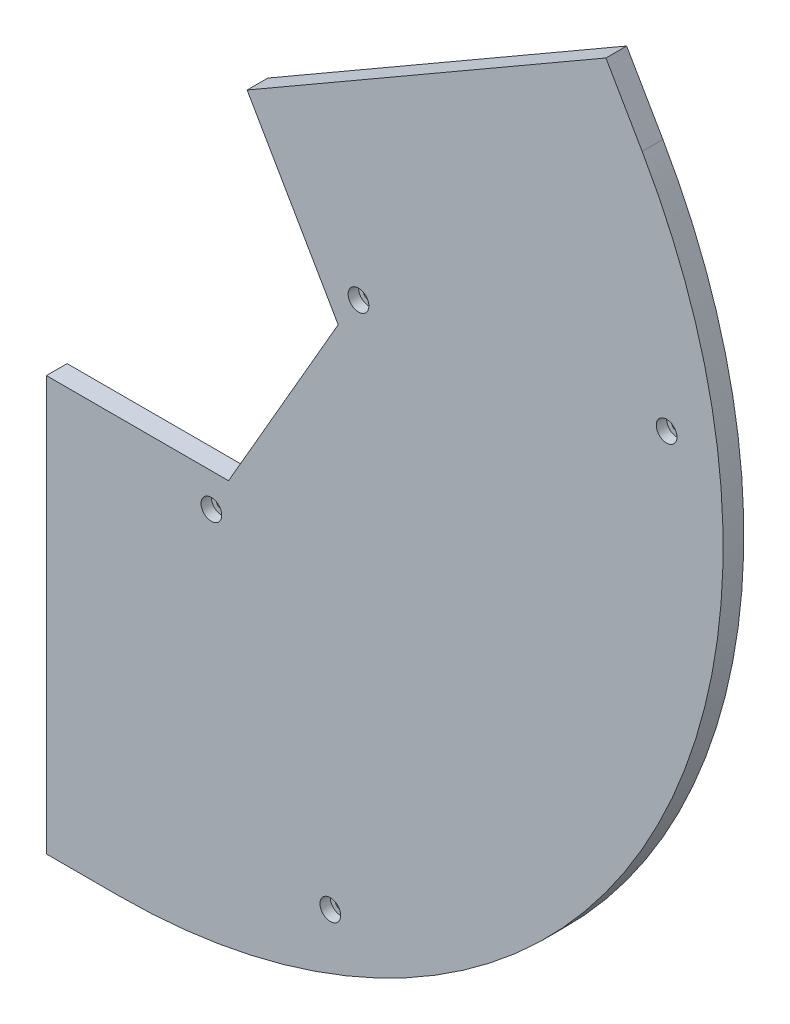
ISO-10303-21;
HEADER;
FILE_DESCRIPTION(('STEP AP214'),'2;1');
FILE_NAME('part.step','',(''),(''),'','','');
FILE_SCHEMA(('AUTOMOTIVE_DESIGN { 1 0 10303 214 1 1 1 1 }'));
ENDSEC;
DATA;
#1=APPLICATION_CONTEXT('core data for automotive mechanical design processes');
#2=APPLICATION_PROTOCOL_DEFINITION('international standard','automotive_design',2000,#1);
#3=PRODUCT_CONTEXT('',#1,'mechanical');
#4=PRODUCT('Part','Part','',(#3));
#5=PRODUCT_RELATED_PRODUCT_CATEGORY('part','',(#4));
#6=PRODUCT_DEFINITION_FORMATION('','',#4);
#7=PRODUCT_DEFINITION_CONTEXT('part definition',#1,'design');
#8=PRODUCT_DEFINITION('design','',#6,#7);
#9=PRODUCT_DEFINITION_SHAPE('','',#8);
#10=(LENGTH_UNIT() NAMED_UNIT(*) SI_UNIT(.MILLI.,.METRE.));
#11=(NAMED_UNIT(*) PLANE_ANGLE_UNIT() SI_UNIT($,.RADIAN.));
#12=(NAMED_UNIT(*) SI_UNIT($,.STERADIAN.) SOLID_ANGLE_UNIT());
#13=UNCERTAINTY_MEASURE_WITH_UNIT(LENGTH_MEASURE(1.E-05),#10,'distance_accuracy_value','');
#14=(GEOMETRIC_REPRESENTATION_CONTEXT(3) GLOBAL_UNCERTAINTY_ASSIGNED_CONTEXT((#13)) GLOBAL_UNIT_ASSIGNED_CONTEXT((#10,
#11,#12)) REPRESENTATION_CONTEXT('',''));
#15=CARTESIAN_POINT('',(0.,0.,0.));
#16=DIRECTION('',(0.,0.,1.));
#17=DIRECTION('',(1.,0.,0.));
#18=AXIS2_PLACEMENT_3D('',#15,#16,#17);
#19=CARTESIAN_POINT('',(26.7878402655564,-64.67156727579,0.));
#20=DIRECTION('',(0.,0.,1.));
#21=DIRECTION('',(1.,0.,0.));
#22=AXIS2_PLACEMENT_3D('',#19,#20,#21);
#23=CYLINDRICAL_SURFACE('',#22,1.60000000000001);
#24=CARTESIAN_POINT('',(26.7878402655564,-64.67156727579,0.));
#25=DIRECTION('',(0.,0.,1.));
#26=DIRECTION('',(1.,0.,0.));
#27=AXIS2_PLACEMENT_3D('',#24,#25,#26);
#28=CIRCLE('',#27,1.60000000000001);
#29=CARTESIAN_POINT('',(28.3878402655564,-64.67156727579,0.));
#30=VERTEX_POINT('',#29);
#31=EDGE_CURVE('E204',#30,#30,#28,.T.);
#32=ORIENTED_EDGE('',*,*,#31,.F.);
#33=EDGE_LOOP('',(#32));
#34=FACE_BOUND('',#33,.T.);
#35=CARTESIAN_POINT('',(26.7878402655564,-64.67156727579,3.));
#36=DIRECTION('',(0.,0.,1.));
#37=DIRECTION('',(1.,0.,0.));
#38=AXIS2_PLACEMENT_3D('',#35,#36,#37);
#39=CIRCLE('',#38,1.60000000000001);
#40=CARTESIAN_POINT('',(28.3878402655564,-64.67156727579,3.));
#41=VERTEX_POINT('',#40);
#42=EDGE_CURVE('E55',#41,#41,#39,.F.);
#43=ORIENTED_EDGE('',*,*,#42,.F.);
#44=EDGE_LOOP('',(#43));
#45=FACE_BOUND('',#44,.T.);
#46=ADVANCED_FACE('F51',(#34,#45),#23,.F.);
#47=CARTESIAN_POINT('',(158.63117781981,20.8841907552089,0.));
#48=DIRECTION('',(0.,0.,1.));
#49=DIRECTION('',(1.,0.,0.));
#50=AXIS2_PLACEMENT_3D('',#47,#48,#49);
#51=CYLINDRICAL_SURFACE('',#50,1.59999999999999);
#52=CARTESIAN_POINT('',(158.63117781981,20.8841907552089,0.));
#53=DIRECTION('',(0.,0.,1.));
#54=DIRECTION('',(-1.,0.,0.));
#55=AXIS2_PLACEMENT_3D('',#52,#53,#54);
#56=CIRCLE('',#55,1.59999999999999);
#57=CARTESIAN_POINT('',(157.03117781981,20.8841907552089,0.));
#58=VERTEX_POINT('',#57);
#59=EDGE_CURVE('E199',#58,#58,#56,.T.);
#60=ORIENTED_EDGE('',*,*,#59,.F.);
#61=EDGE_LOOP('',(#60));
#62=FACE_BOUND('',#61,.T.);
#63=CARTESIAN_POINT('',(158.63117781981,20.8841907552089,3.));
#64=DIRECTION('',(0.,0.,1.));
#65=DIRECTION('',(1.,0.,0.));
#66=AXIS2_PLACEMENT_3D('',#63,#64,#65);
#67=CIRCLE('',#66,1.59999999999999);
#68=CARTESIAN_POINT('',(160.23117781981,20.8841907552089,3.));
#69=VERTEX_POINT('',#68);
#70=EDGE_CURVE('E190',#69,#69,#67,.F.);
#71=ORIENTED_EDGE('',*,*,#70,.F.);
#72=EDGE_LOOP('',(#71));
#73=FACE_BOUND('',#72,.T.);
#74=ADVANCED_FACE('F242',(#62,#73),#51,.F.);
#75=CARTESIAN_POINT('',(69.4011402961667,9.13683345540391,0.));
#76=DIRECTION('',(0.,0.,1.));
#77=DIRECTION('',(1.,0.,0.));
#78=AXIS2_PLACEMENT_3D('',#75,#76,#77);
#79=CYLINDRICAL_SURFACE('',#78,1.6);
#80=CARTESIAN_POINT('',(69.4011402961667,9.13683345540391,0.));
#81=DIRECTION('',(0.,0.,1.));
#82=DIRECTION('',(-1.,0.,0.));
#83=AXIS2_PLACEMENT_3D('',#80,#81,#82);
#84=CIRCLE('',#83,1.6);
#85=CARTESIAN_POINT('',(67.8011402961667,9.13683345540391,0.));
#86=VERTEX_POINT('',#85);
#87=EDGE_CURVE('E195',#86,#86,#84,.T.);
#88=ORIENTED_EDGE('',*,*,#87,.F.);
#89=EDGE_LOOP('',(#88));
#90=FACE_BOUND('',#89,.T.);
#91=CARTESIAN_POINT('',(69.4011402961667,9.13683345540391,3.));
#92=DIRECTION('',(0.,0.,1.));
#93=DIRECTION('',(1.,0.,0.));
#94=AXIS2_PLACEMENT_3D('',#91,#92,#93);
#95=CIRCLE('',#94,1.6);
#96=CARTESIAN_POINT('',(71.0011402961667,9.13683345540391,3.));
#97=VERTEX_POINT('',#96);
#98=EDGE_CURVE('E187',#97,#97,#95,.F.);
#99=ORIENTED_EDGE('',*,*,#98,.F.);
#100=EDGE_LOOP('',(#99));
#101=FACE_BOUND('',#100,.T.);
#102=ADVANCED_FACE('F238',(#90,#101),#79,.F.);
#103=CARTESIAN_POINT('',(61.2293491784146,-147.820725201806,0.));
#104=DIRECTION('',(0.,0.,1.));
#105=DIRECTION('',(1.,0.,0.));
#106=AXIS2_PLACEMENT_3D('',#103,#104,#105);
#107=CYLINDRICAL_SURFACE('',#106,1.6);
#108=CARTESIAN_POINT('',(61.2293491784146,-147.820725201806,0.));
#109=DIRECTION('',(0.,0.,1.));
#110=DIRECTION('',(1.,0.,0.));
#111=AXIS2_PLACEMENT_3D('',#108,#109,#110);
#112=CIRCLE('',#111,1.6);
#113=CARTESIAN_POINT('',(62.8293491784146,-147.820725201806,0.));
#114=VERTEX_POINT('',#113);
#115=EDGE_CURVE('E140',#114,#114,#112,.T.);
#116=ORIENTED_EDGE('',*,*,#115,.F.);
#117=EDGE_LOOP('',(#116));
#118=FACE_BOUND('',#117,.T.);
#119=CARTESIAN_POINT('',(61.2293491784146,-147.820725201806,3.));
#120=DIRECTION('',(0.,0.,1.));
#121=DIRECTION('',(1.,0.,0.));
#122=AXIS2_PLACEMENT_3D('',#119,#120,#121);
#123=CIRCLE('',#122,1.6);
#124=CARTESIAN_POINT('',(62.8293491784146,-147.820725201806,3.));
#125=VERTEX_POINT('',#124);
#126=EDGE_CURVE('E184',#125,#125,#123,.F.);
#127=ORIENTED_EDGE('',*,*,#126,.F.);
#128=EDGE_LOOP('',(#127));
#129=FACE_BOUND('',#128,.T.);
#130=ADVANCED_FACE('F231',(#118,#129),#107,.F.);
#131=CARTESIAN_POINT('',(0.,0.,6.));
#132=DIRECTION('',(0.,0.,-1.));
#133=DIRECTION('',(-1.,0.,0.));
#134=AXIS2_PLACEMENT_3D('',#131,#132,#133);
#135=CYLINDRICAL_SURFACE('',#134,175.);
#136=CARTESIAN_POINT('',(0.,0.,0.));
#137=DIRECTION('',(0.,0.,1.));
#138=DIRECTION('',(-1.,0.,0.));
#139=AXIS2_PLACEMENT_3D('',#136,#137,#138);
#140=CIRCLE('',#139,175.);
#141=CARTESIAN_POINT('',(0.,-175.,0.));
#142=VERTEX_POINT('',#141);
#143=CARTESIAN_POINT('',(151.554445662276,87.5000000000008,0.));
#144=VERTEX_POINT('',#143);
#145=EDGE_CURVE('E179',#142,#144,#140,.T.);
#146=ORIENTED_EDGE('',*,*,#145,.T.);
#147=DIRECTION('',(0.,0.,-1.));
#148=VECTOR('',#147,1.);
#149=CARTESIAN_POINT('',(151.554445662276,87.5000000000008,6.));
#150=LINE('',#149,#148);
#151=CARTESIAN_POINT('',(151.554445662276,87.5000000000008,6.));
#152=VERTEX_POINT('',#151);
#153=EDGE_CURVE('E60',#152,#144,#150,.T.);
#154=ORIENTED_EDGE('',*,*,#153,.F.);
#155=CARTESIAN_POINT('',(0.,0.,6.));
#156=DIRECTION('',(0.,0.,1.));
#157=DIRECTION('',(-1.,0.,0.));
#158=AXIS2_PLACEMENT_3D('',#155,#156,#157);
#159=CIRCLE('',#158,175.);
#160=CARTESIAN_POINT('',(0.,-175.,6.));
#161=VERTEX_POINT('',#160);
#162=EDGE_CURVE('E77',#161,#152,#159,.T.);
#163=ORIENTED_EDGE('',*,*,#162,.F.);
#164=DIRECTION('',(0.,0.,-1.));
#165=VECTOR('',#164,1.);
#166=CARTESIAN_POINT('',(0.,-175.,6.));
#167=LINE('',#166,#165);
#168=EDGE_CURVE('E12',#161,#142,#167,.T.);
#169=ORIENTED_EDGE('',*,*,#168,.T.);
#170=EDGE_LOOP('',(#146,#154,#163,#169));
#171=FACE_BOUND('',#170,.T.);
#172=ADVANCED_FACE('F53',(#171),#135,.T.);
#173=CARTESIAN_POINT('',(0.,0.,6.));
#174=DIRECTION('',(0.,0.,-1.));
#175=DIRECTION('',(-1.,0.,0.));
#176=AXIS2_PLACEMENT_3D('',#173,#174,#175);
#177=PLANE('',#176);
#178=CARTESIAN_POINT('',(61.2293491784146,-147.820725201806,6.));
#179=DIRECTION('',(0.,0.,1.));
#180=DIRECTION('',(1.,0.,0.));
#181=AXIS2_PLACEMENT_3D('',#178,#179,#180);
#182=CIRCLE('',#181,3.00000000000001);
#183=CARTESIAN_POINT('',(64.2293491784146,-147.820725201806,6.));
#184=VERTEX_POINT('',#183);
#185=EDGE_CURVE('E339',#184,#184,#182,.T.);
#186=ORIENTED_EDGE('',*,*,#185,.F.);
#187=EDGE_LOOP('',(#186));
#188=FACE_BOUND('',#187,.T.);
#189=CARTESIAN_POINT('',(26.7878402655564,-64.67156727579,6.));
#190=DIRECTION('',(0.,0.,1.));
#191=DIRECTION('',(1.,0.,0.));
#192=AXIS2_PLACEMENT_3D('',#189,#190,#191);
#193=CIRCLE('',#192,3.);
#194=CARTESIAN_POINT('',(29.7878402655564,-64.67156727579,6.));
#195=VERTEX_POINT('',#194);
#196=EDGE_CURVE('E333',#195,#195,#193,.T.);
#197=ORIENTED_EDGE('',*,*,#196,.F.);
#198=EDGE_LOOP('',(#197));
#199=FACE_BOUND('',#198,.T.);
#200=CARTESIAN_POINT('',(69.4011402961667,9.13683345540391,6.));
#201=DIRECTION('',(0.,0.,1.));
#202=DIRECTION('',(1.,0.,0.));
#203=AXIS2_PLACEMENT_3D('',#200,#201,#202);
#204=CIRCLE('',#203,3.00000000000001);
#205=CARTESIAN_POINT('',(72.4011402961667,9.13683345540391,6.));
#206=VERTEX_POINT('',#205);
#207=EDGE_CURVE('E325',#206,#206,#204,.T.);
#208=ORIENTED_EDGE('',*,*,#207,.F.);
#209=EDGE_LOOP('',(#208));
#210=FACE_BOUND('',#209,.T.);
#211=CARTESIAN_POINT('',(158.63117781981,20.8841907552089,6.));
#212=DIRECTION('',(0.,0.,1.));
#213=DIRECTION('',(1.,0.,0.));
#214=AXIS2_PLACEMENT_3D('',#211,#212,#213);
#215=CIRCLE('',#214,2.99999999999999);
#216=CARTESIAN_POINT('',(161.63117781981,20.8841907552089,6.));
#217=VERTEX_POINT('',#216);
#218=EDGE_CURVE('E323',#217,#217,#215,.T.);
#219=ORIENTED_EDGE('',*,*,#218,.F.);
#220=EDGE_LOOP('',(#219));
#221=FACE_BOUND('',#220,.T.);
#222=ORIENTED_EDGE('',*,*,#162,.T.);
#223=DIRECTION('',(0.500000000000004,-0.866025403784436,0.));
#224=VECTOR('',#223,1.);
#225=CARTESIAN_POINT('',(141.054445662276,105.686533479474,6.));
#226=LINE('',#225,#224);
#227=CARTESIAN_POINT('',(141.054445662276,105.686533479474,6.));
#228=VERTEX_POINT('',#227);
#229=EDGE_CURVE('E144',#228,#152,#226,.T.);
#230=ORIENTED_EDGE('',*,*,#229,.F.);
#231=DIRECTION('',(0.866025403784436,0.500000000000004,0.));
#232=VECTOR('',#231,1.);
#233=CARTESIAN_POINT('',(37.1313972081439,45.6865334794734,6.));
#234=LINE('',#233,#232);
#235=CARTESIAN_POINT('',(37.1313972081439,45.6865334794734,6.));
#236=VERTEX_POINT('',#235);
#237=EDGE_CURVE('E137',#236,#228,#234,.T.);
#238=ORIENTED_EDGE('',*,*,#237,.F.);
#239=DIRECTION('',(-0.499999999999998,0.86602540378444,0.));
#240=VECTOR('',#239,1.);
#241=CARTESIAN_POINT('',(47.6313972081442,27.4999999999999,6.));
#242=LINE('',#241,#240);
#243=CARTESIAN_POINT('',(63.5085296108588,0.,6.));
#244=VERTEX_POINT('',#243);
#245=EDGE_CURVE('E167',#244,#236,#242,.T.);
#246=ORIENTED_EDGE('',*,*,#245,.F.);
#247=DIRECTION('',(0.499999999999998,0.86602540378444,0.));
#248=VECTOR('',#247,1.);
#249=CARTESIAN_POINT('',(47.6313972081442,-27.4999999999999,6.));
#250=LINE('',#249,#248);
#251=CARTESIAN_POINT('',(31.7542648054295,-55.,6.));
#252=VERTEX_POINT('',#251);
#253=EDGE_CURVE('E173',#252,#244,#250,.T.);
#254=ORIENTED_EDGE('',*,*,#253,.F.);
#255=DIRECTION('',(1.,0.,0.));
#256=VECTOR('',#255,1.);
#257=CARTESIAN_POINT('',(0.,-55.,6.));
#258=LINE('',#257,#256);
#259=CARTESIAN_POINT('',(-21.,-55.,6.));
#260=VERTEX_POINT('',#259);
#261=EDGE_CURVE('E163',#260,#252,#258,.T.);
#262=ORIENTED_EDGE('',*,*,#261,.F.);
#263=DIRECTION('',(0.,1.,0.));
#264=VECTOR('',#263,1.);
#265=CARTESIAN_POINT('',(-21.,-175.,6.));
#266=LINE('',#265,#264);
#267=CARTESIAN_POINT('',(-21.,-175.,6.));
#268=VERTEX_POINT('',#267);
#269=EDGE_CURVE('E147',#268,#260,#266,.T.);
#270=ORIENTED_EDGE('',*,*,#269,.F.);
#271=DIRECTION('',(1.,0.,0.));
#272=VECTOR('',#271,1.);
#273=CARTESIAN_POINT('',(-21.,-175.,6.));
#274=LINE('',#273,#272);
#275=EDGE_CURVE('E161',#268,#161,#274,.T.);
#276=ORIENTED_EDGE('',*,*,#275,.T.);
#277=EDGE_LOOP('',(#222,#230,#238,#246,#254,#262,#270,#276));
#278=FACE_BOUND('',#277,.T.);
#279=ADVANCED_FACE('F213',(#188,#199,#210,#221,#278),#177,.F.);
#280=CARTESIAN_POINT('',(0.,0.,0.));
#281=DIRECTION('',(0.,0.,-1.));
#282=DIRECTION('',(-1.,0.,0.));
#283=AXIS2_PLACEMENT_3D('',#280,#281,#282);
#284=PLANE('',#283);
#285=ORIENTED_EDGE('',*,*,#115,.T.);
#286=EDGE_LOOP('',(#285));
#287=FACE_BOUND('',#286,.T.);
#288=ORIENTED_EDGE('',*,*,#87,.T.);
#289=EDGE_LOOP('',(#288));
#290=FACE_BOUND('',#289,.T.);
#291=ORIENTED_EDGE('',*,*,#59,.T.);
#292=EDGE_LOOP('',(#291));
#293=FACE_BOUND('',#292,.T.);
#294=ORIENTED_EDGE('',*,*,#31,.T.);
#295=EDGE_LOOP('',(#294));
#296=FACE_BOUND('',#295,.T.);
#297=DIRECTION('',(-0.499999999999998,0.86602540378444,0.));
#298=VECTOR('',#297,1.);
#299=CARTESIAN_POINT('',(47.6313972081442,27.4999999999999,0.));
#300=LINE('',#299,#298);
#301=CARTESIAN_POINT('',(63.5085296108588,0.,0.));
#302=VERTEX_POINT('',#301);
#303=CARTESIAN_POINT('',(37.1313972081439,45.6865334794734,0.));
#304=VERTEX_POINT('',#303);
#305=EDGE_CURVE('E127',#302,#304,#300,.T.);
#306=ORIENTED_EDGE('',*,*,#305,.T.);
#307=DIRECTION('',(-0.866025403784436,-0.500000000000004,0.));
#308=VECTOR('',#307,1.);
#309=CARTESIAN_POINT('',(141.054445662276,105.686533479474,0.));
#310=LINE('',#309,#308);
#311=CARTESIAN_POINT('',(141.054445662276,105.686533479474,0.));
#312=VERTEX_POINT('',#311);
#313=EDGE_CURVE('E119',#312,#304,#310,.T.);
#314=ORIENTED_EDGE('',*,*,#313,.F.);
#315=DIRECTION('',(0.500000000000004,-0.866025403784436,0.));
#316=VECTOR('',#315,1.);
#317=CARTESIAN_POINT('',(141.054445662276,105.686533479474,0.));
#318=LINE('',#317,#316);
#319=EDGE_CURVE('E124',#312,#144,#318,.T.);
#320=ORIENTED_EDGE('',*,*,#319,.T.);
#321=ORIENTED_EDGE('',*,*,#145,.F.);
#322=DIRECTION('',(1.,0.,0.));
#323=VECTOR('',#322,1.);
#324=CARTESIAN_POINT('',(-21.,-175.,0.));
#325=LINE('',#324,#323);
#326=CARTESIAN_POINT('',(-21.,-175.,0.));
#327=VERTEX_POINT('',#326);
#328=EDGE_CURVE('E159',#327,#142,#325,.T.);
#329=ORIENTED_EDGE('',*,*,#328,.F.);
#330=DIRECTION('',(0.,-1.,0.));
#331=VECTOR('',#330,1.);
#332=CARTESIAN_POINT('',(-21.,-55.,0.));
#333=LINE('',#332,#331);
#334=CARTESIAN_POINT('',(-21.,-55.,0.));
#335=VERTEX_POINT('',#334);
#336=EDGE_CURVE('E157',#335,#327,#333,.T.);
#337=ORIENTED_EDGE('',*,*,#336,.F.);
#338=DIRECTION('',(1.,0.,0.));
#339=VECTOR('',#338,1.);
#340=CARTESIAN_POINT('',(0.,-55.,0.));
#341=LINE('',#340,#339);
#342=CARTESIAN_POINT('',(31.7542648054295,-55.,0.));
#343=VERTEX_POINT('',#342);
#344=EDGE_CURVE('E164',#335,#343,#341,.T.);
#345=ORIENTED_EDGE('',*,*,#344,.T.);
#346=DIRECTION('',(0.499999999999998,0.86602540378444,0.));
#347=VECTOR('',#346,1.);
#348=CARTESIAN_POINT('',(47.6313972081442,-27.4999999999999,0.));
#349=LINE('',#348,#347);
#350=EDGE_CURVE('E68',#343,#302,#349,.T.);
#351=ORIENTED_EDGE('',*,*,#350,.T.);
#352=EDGE_LOOP('',(#306,#314,#320,#321,#329,#337,#345,#351));
#353=FACE_BOUND('',#352,.T.);
#354=ADVANCED_FACE('F121',(#287,#290,#293,#296,#353),#284,.T.);
#355=CARTESIAN_POINT('',(47.6313972081442,27.4999999999999,0.));
#356=DIRECTION('',(0.86602540378444,0.499999999999998,0.));
#357=DIRECTION('',(-0.499999999999998,0.86602540378444,0.));
#358=AXIS2_PLACEMENT_3D('',#355,#356,#357);
#359=PLANE('',#358);
#360=ORIENTED_EDGE('',*,*,#245,.T.);
#361=DIRECTION('',(0.,0.,1.));
#362=VECTOR('',#361,1.);
#363=CARTESIAN_POINT('',(37.1313972081439,45.6865334794734,0.));
#364=LINE('',#363,#362);
#365=EDGE_CURVE('E131',#304,#236,#364,.T.);
#366=ORIENTED_EDGE('',*,*,#365,.F.);
#367=ORIENTED_EDGE('',*,*,#305,.F.);
#368=DIRECTION('',(0.,0.,1.));
#369=VECTOR('',#368,1.);
#370=CARTESIAN_POINT('',(63.5085296108588,0.,0.));
#371=LINE('',#370,#369);
#372=EDGE_CURVE('E176',#302,#244,#371,.T.);
#373=ORIENTED_EDGE('',*,*,#372,.T.);
#374=EDGE_LOOP('',(#360,#366,#367,#373));
#375=FACE_BOUND('',#374,.T.);
#376=ADVANCED_FACE('F215',(#375),#359,.F.);
#377=CARTESIAN_POINT('',(47.6313972081442,-27.4999999999999,0.));
#378=DIRECTION('',(0.86602540378444,-0.499999999999998,0.));
#379=DIRECTION('',(0.499999999999998,0.86602540378444,0.));
#380=AXIS2_PLACEMENT_3D('',#377,#378,#379);
#381=PLANE('',#380);
#382=ORIENTED_EDGE('',*,*,#372,.F.);
#383=ORIENTED_EDGE('',*,*,#350,.F.);
#384=DIRECTION('',(0.,0.,1.));
#385=VECTOR('',#384,1.);
#386=CARTESIAN_POINT('',(31.7542648054295,-55.,0.));
#387=LINE('',#386,#385);
#388=EDGE_CURVE('E170',#343,#252,#387,.T.);
#389=ORIENTED_EDGE('',*,*,#388,.T.);
#390=ORIENTED_EDGE('',*,*,#253,.T.);
#391=EDGE_LOOP('',(#382,#383,#389,#390));
#392=FACE_BOUND('',#391,.T.);
#393=ADVANCED_FACE('F216',(#392),#381,.F.);
#394=CARTESIAN_POINT('',(0.,-55.,0.));
#395=DIRECTION('',(0.,-1.,0.));
#396=DIRECTION('',(0.,0.,-1.));
#397=AXIS2_PLACEMENT_3D('',#394,#395,#396);
#398=PLANE('',#397);
#399=ORIENTED_EDGE('',*,*,#261,.T.);
#400=ORIENTED_EDGE('',*,*,#388,.F.);
#401=ORIENTED_EDGE('',*,*,#344,.F.);
#402=DIRECTION('',(0.,0.,-1.));
#403=VECTOR('',#402,1.);
#404=CARTESIAN_POINT('',(-21.,-55.,6.));
#405=LINE('',#404,#403);
#406=EDGE_CURVE('E154',#260,#335,#405,.T.);
#407=ORIENTED_EDGE('',*,*,#406,.F.);
#408=EDGE_LOOP('',(#399,#400,#401,#407));
#409=FACE_BOUND('',#408,.T.);
#410=ADVANCED_FACE('F219',(#409),#398,.F.);
#411=CARTESIAN_POINT('',(-21.,-175.,0.));
#412=DIRECTION('',(0.,1.,0.));
#413=DIRECTION('',(0.,0.,1.));
#414=AXIS2_PLACEMENT_3D('',#411,#412,#413);
#415=PLANE('',#414);
#416=ORIENTED_EDGE('',*,*,#168,.F.);
#417=ORIENTED_EDGE('',*,*,#275,.F.);
#418=DIRECTION('',(0.,0.,1.));
#419=VECTOR('',#418,1.);
#420=CARTESIAN_POINT('',(-21.,-175.,0.));
#421=LINE('',#420,#419);
#422=EDGE_CURVE('E143',#327,#268,#421,.T.);
#423=ORIENTED_EDGE('',*,*,#422,.F.);
#424=ORIENTED_EDGE('',*,*,#328,.T.);
#425=EDGE_LOOP('',(#416,#417,#423,#424));
#426=FACE_BOUND('',#425,.T.);
#427=ADVANCED_FACE('F228',(#426),#415,.F.);
#428=CARTESIAN_POINT('',(-21.,0.,0.));
#429=DIRECTION('',(-1.,0.,0.));
#430=DIRECTION('',(0.,0.,1.));
#431=AXIS2_PLACEMENT_3D('',#428,#429,#430);
#432=PLANE('',#431);
#433=ORIENTED_EDGE('',*,*,#422,.T.);
#434=ORIENTED_EDGE('',*,*,#269,.T.);
#435=ORIENTED_EDGE('',*,*,#406,.T.);
#436=ORIENTED_EDGE('',*,*,#336,.T.);
#437=EDGE_LOOP('',(#433,#434,#435,#436));
#438=FACE_BOUND('',#437,.T.);
#439=ADVANCED_FACE('F221',(#438),#432,.T.);
#440=CARTESIAN_POINT('',(141.054445662276,105.686533479474,6.));
#441=DIRECTION('',(-0.866025403784436,-0.500000000000004,0.));
#442=DIRECTION('',(0.500000000000005,-0.866025403784436,0.));
#443=AXIS2_PLACEMENT_3D('',#440,#441,#442);
#444=PLANE('',#443);
#445=ORIENTED_EDGE('',*,*,#153,.T.);
#446=ORIENTED_EDGE('',*,*,#319,.F.);
#447=DIRECTION('',(0.,0.,-1.));
#448=VECTOR('',#447,1.);
#449=CARTESIAN_POINT('',(141.054445662276,105.686533479474,6.));
#450=LINE('',#449,#448);
#451=EDGE_CURVE('E132',#228,#312,#450,.T.);
#452=ORIENTED_EDGE('',*,*,#451,.F.);
#453=ORIENTED_EDGE('',*,*,#229,.T.);
#454=EDGE_LOOP('',(#445,#446,#452,#453));
#455=FACE_BOUND('',#454,.T.);
#456=ADVANCED_FACE('F142',(#455),#444,.F.);
#457=CARTESIAN_POINT('',(-10.5000000000001,18.1865334794732,0.));
#458=DIRECTION('',(-0.500000000000005,0.866025403784436,0.));
#459=DIRECTION('',(-0.866025403784436,-0.500000000000004,0.));
#460=AXIS2_PLACEMENT_3D('',#457,#458,#459);
#461=PLANE('',#460);
#462=ORIENTED_EDGE('',*,*,#451,.T.);
#463=ORIENTED_EDGE('',*,*,#313,.T.);
#464=ORIENTED_EDGE('',*,*,#365,.T.);
#465=ORIENTED_EDGE('',*,*,#237,.T.);
#466=EDGE_LOOP('',(#462,#463,#464,#465));
#467=FACE_BOUND('',#466,.T.);
#468=ADVANCED_FACE('F135',(#467),#461,.T.);
#469=CARTESIAN_POINT('',(61.2293491784146,-147.820725201806,3.));
#470=DIRECTION('',(0.,0.,1.));
#471=DIRECTION('',(1.,0.,0.));
#472=AXIS2_PLACEMENT_3D('',#469,#470,#471);
#473=PLANE('',#472);
#474=CARTESIAN_POINT('',(61.2293491784146,-147.820725201806,3.));
#475=DIRECTION('',(0.,0.,1.));
#476=DIRECTION('',(1.,0.,0.));
#477=AXIS2_PLACEMENT_3D('',#474,#475,#476);
#478=CIRCLE('',#477,3.00000000000001);
#479=CARTESIAN_POINT('',(64.2293491784146,-147.820725201806,3.));
#480=VERTEX_POINT('',#479);
#481=EDGE_CURVE('E188',#480,#480,#478,.T.);
#482=ORIENTED_EDGE('',*,*,#481,.T.);
#483=EDGE_LOOP('',(#482));
#484=FACE_BOUND('',#483,.T.);
#485=ORIENTED_EDGE('',*,*,#126,.T.);
#486=EDGE_LOOP('',(#485));
#487=FACE_BOUND('',#486,.T.);
#488=ADVANCED_FACE('F256',(#484,#487),#473,.T.);
#489=CARTESIAN_POINT('',(61.2293491784146,-147.820725201806,3.));
#490=DIRECTION('',(0.,0.,1.));
#491=DIRECTION('',(1.,0.,0.));
#492=AXIS2_PLACEMENT_3D('',#489,#490,#491);
#493=CYLINDRICAL_SURFACE('',#492,3.00000000000001);
#494=ORIENTED_EDGE('',*,*,#481,.F.);
#495=EDGE_LOOP('',(#494));
#496=FACE_BOUND('',#495,.T.);
#497=ORIENTED_EDGE('',*,*,#185,.T.);
#498=EDGE_LOOP('',(#497));
#499=FACE_BOUND('',#498,.T.);
#500=ADVANCED_FACE('F282',(#496,#499),#493,.F.);
#501=CARTESIAN_POINT('',(69.4011402961667,9.13683345540391,3.));
#502=DIRECTION('',(0.,0.,1.));
#503=DIRECTION('',(1.,0.,0.));
#504=AXIS2_PLACEMENT_3D('',#501,#502,#503);
#505=PLANE('',#504);
#506=CARTESIAN_POINT('',(69.4011402961667,9.13683345540391,3.));
#507=DIRECTION('',(0.,0.,1.));
#508=DIRECTION('',(1.,0.,0.));
#509=AXIS2_PLACEMENT_3D('',#506,#507,#508);
#510=CIRCLE('',#509,3.00000000000001);
#511=CARTESIAN_POINT('',(72.4011402961667,9.13683345540391,3.));
#512=VERTEX_POINT('',#511);
#513=EDGE_CURVE('E330',#512,#512,#510,.T.);
#514=ORIENTED_EDGE('',*,*,#513,.T.);
#515=EDGE_LOOP('',(#514));
#516=FACE_BOUND('',#515,.T.);
#517=ORIENTED_EDGE('',*,*,#98,.T.);
#518=EDGE_LOOP('',(#517));
#519=FACE_BOUND('',#518,.T.);
#520=ADVANCED_FACE('F288',(#516,#519),#505,.T.);
#521=CARTESIAN_POINT('',(69.4011402961667,9.13683345540391,3.));
#522=DIRECTION('',(0.,0.,1.));
#523=DIRECTION('',(1.,0.,0.));
#524=AXIS2_PLACEMENT_3D('',#521,#522,#523);
#525=CYLINDRICAL_SURFACE('',#524,3.00000000000001);
#526=ORIENTED_EDGE('',*,*,#513,.F.);
#527=EDGE_LOOP('',(#526));
#528=FACE_BOUND('',#527,.T.);
#529=ORIENTED_EDGE('',*,*,#207,.T.);
#530=EDGE_LOOP('',(#529));
#531=FACE_BOUND('',#530,.T.);
#532=ADVANCED_FACE('F304',(#528,#531),#525,.F.);
#533=CARTESIAN_POINT('',(158.63117781981,20.8841907552089,3.));
#534=DIRECTION('',(0.,0.,1.));
#535=DIRECTION('',(1.,0.,0.));
#536=AXIS2_PLACEMENT_3D('',#533,#534,#535);
#537=PLANE('',#536);
#538=CARTESIAN_POINT('',(158.63117781981,20.8841907552089,3.));
#539=DIRECTION('',(0.,0.,1.));
#540=DIRECTION('',(1.,0.,0.));
#541=AXIS2_PLACEMENT_3D('',#538,#539,#540);
#542=CIRCLE('',#541,2.99999999999999);
#543=CARTESIAN_POINT('',(161.63117781981,20.8841907552089,3.));
#544=VERTEX_POINT('',#543);
#545=EDGE_CURVE('E320',#544,#544,#542,.T.);
#546=ORIENTED_EDGE('',*,*,#545,.T.);
#547=EDGE_LOOP('',(#546));
#548=FACE_BOUND('',#547,.T.);
#549=ORIENTED_EDGE('',*,*,#70,.T.);
#550=EDGE_LOOP('',(#549));
#551=FACE_BOUND('',#550,.T.);
#552=ADVANCED_FACE('F308',(#548,#551),#537,.T.);
#553=CARTESIAN_POINT('',(158.63117781981,20.8841907552089,3.));
#554=DIRECTION('',(0.,0.,1.));
#555=DIRECTION('',(1.,0.,0.));
#556=AXIS2_PLACEMENT_3D('',#553,#554,#555);
#557=CYLINDRICAL_SURFACE('',#556,2.99999999999999);
#558=ORIENTED_EDGE('',*,*,#545,.F.);
#559=EDGE_LOOP('',(#558));
#560=FACE_BOUND('',#559,.T.);
#561=ORIENTED_EDGE('',*,*,#218,.T.);
#562=EDGE_LOOP('',(#561));
#563=FACE_BOUND('',#562,.T.);
#564=ADVANCED_FACE('F297',(#560,#563),#557,.F.);
#565=CARTESIAN_POINT('',(26.7878402655564,-64.67156727579,3.));
#566=DIRECTION('',(0.,0.,1.));
#567=DIRECTION('',(1.,0.,0.));
#568=AXIS2_PLACEMENT_3D('',#565,#566,#567);
#569=PLANE('',#568);
#570=CARTESIAN_POINT('',(26.7878402655564,-64.67156727579,3.));
#571=DIRECTION('',(0.,0.,1.));
#572=DIRECTION('',(1.,0.,0.));
#573=AXIS2_PLACEMENT_3D('',#570,#571,#572);
#574=CIRCLE('',#573,3.);
#575=CARTESIAN_POINT('',(29.7878402655564,-64.67156727579,3.));
#576=VERTEX_POINT('',#575);
#577=EDGE_CURVE('E336',#576,#576,#574,.T.);
#578=ORIENTED_EDGE('',*,*,#577,.T.);
#579=EDGE_LOOP('',(#578));
#580=FACE_BOUND('',#579,.T.);
#581=ORIENTED_EDGE('',*,*,#42,.T.);
#582=EDGE_LOOP('',(#581));
#583=FACE_BOUND('',#582,.T.);
#584=ADVANCED_FACE('F293',(#580,#583),#569,.T.);
#585=CARTESIAN_POINT('',(26.7878402655564,-64.67156727579,3.));
#586=DIRECTION('',(0.,0.,1.));
#587=DIRECTION('',(1.,0.,0.));
#588=AXIS2_PLACEMENT_3D('',#585,#586,#587);
#589=CYLINDRICAL_SURFACE('',#588,3.);
#590=ORIENTED_EDGE('',*,*,#577,.F.);
#591=EDGE_LOOP('',(#590));
#592=FACE_BOUND('',#591,.T.);
#593=ORIENTED_EDGE('',*,*,#196,.T.);
#594=EDGE_LOOP('',(#593));
#595=FACE_BOUND('',#594,.T.);
#596=ADVANCED_FACE('F296',(#592,#595),#589,.F.);
#597=CLOSED_SHELL('',(#46,#74,#102,#130,#172,#279,#354,#376,#393,#410,#427,#439,#456,#468,#488,
#500,#520,#532,#552,#564,#584,#596));
#598=MANIFOLD_SOLID_BREP('B2',#597);
#599=ADVANCED_BREP_SHAPE_REPRESENTATION('',(#18,#598),#14);
#600=SHAPE_DEFINITION_REPRESENTATION(#9,#599);
ENDSEC;
END-ISO-10303-21;
